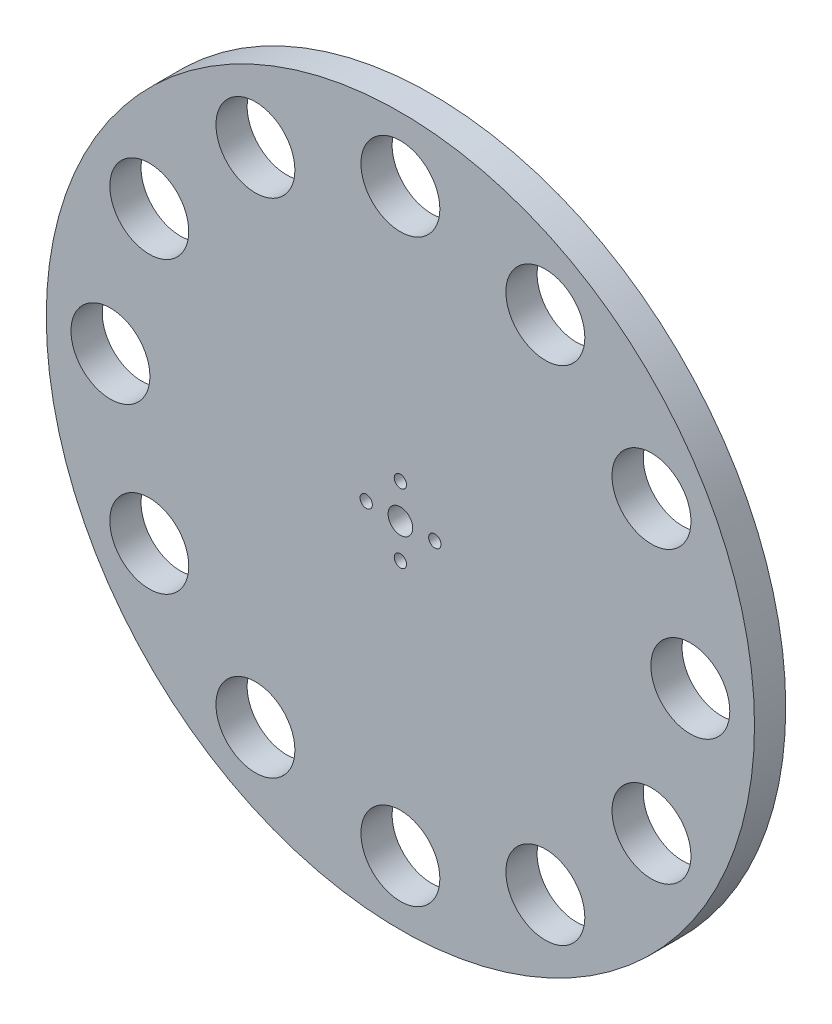
ISO-10303-21;
HEADER;
FILE_DESCRIPTION(('STEP AP214'),'2;1');
FILE_NAME('part.step','',(''),(''),'','','');
FILE_SCHEMA(('AUTOMOTIVE_DESIGN { 1 0 10303 214 1 1 1 1 }'));
ENDSEC;
DATA;
#1=APPLICATION_CONTEXT('core data for automotive mechanical design processes');
#2=APPLICATION_PROTOCOL_DEFINITION('international standard','automotive_design',2000,#1);
#3=PRODUCT_CONTEXT('',#1,'mechanical');
#4=PRODUCT('Part','Part','',(#3));
#5=PRODUCT_RELATED_PRODUCT_CATEGORY('part','',(#4));
#6=PRODUCT_DEFINITION_FORMATION('','',#4);
#7=PRODUCT_DEFINITION_CONTEXT('part definition',#1,'design');
#8=PRODUCT_DEFINITION('design','',#6,#7);
#9=PRODUCT_DEFINITION_SHAPE('','',#8);
#10=(LENGTH_UNIT() NAMED_UNIT(*) SI_UNIT(.MILLI.,.METRE.));
#11=(NAMED_UNIT(*) PLANE_ANGLE_UNIT() SI_UNIT($,.RADIAN.));
#12=(NAMED_UNIT(*) SI_UNIT($,.STERADIAN.) SOLID_ANGLE_UNIT());
#13=UNCERTAINTY_MEASURE_WITH_UNIT(LENGTH_MEASURE(1.E-05),#10,'distance_accuracy_value','');
#14=(GEOMETRIC_REPRESENTATION_CONTEXT(3) GLOBAL_UNCERTAINTY_ASSIGNED_CONTEXT((#13)) GLOBAL_UNIT_ASSIGNED_CONTEXT((#10,
#11,#12)) REPRESENTATION_CONTEXT('',''));
#15=CARTESIAN_POINT('',(0.,0.,0.));
#16=DIRECTION('',(0.,0.,1.));
#17=DIRECTION('',(1.,0.,0.));
#18=AXIS2_PLACEMENT_3D('',#15,#16,#17);
#19=CARTESIAN_POINT('',(51.0521975530926,-29.4750000000001,6.35));
#20=DIRECTION('',(0.,0.,-1.));
#21=DIRECTION('',(-1.,0.,0.));
#22=AXIS2_PLACEMENT_3D('',#19,#20,#21);
#23=CYLINDRICAL_SURFACE('',#22,8.025);
#24=CARTESIAN_POINT('',(51.0521975530926,-29.4750000000001,6.35));
#25=DIRECTION('',(0.,0.,1.));
#26=DIRECTION('',(1.,0.,0.));
#27=AXIS2_PLACEMENT_3D('',#24,#25,#26);
#28=CIRCLE('',#27,8.025);
#29=CARTESIAN_POINT('',(59.0771975530926,-29.4750000000001,6.35));
#30=VERTEX_POINT('',#29);
#31=EDGE_CURVE('E43',#30,#30,#28,.T.);
#32=ORIENTED_EDGE('',*,*,#31,.T.);
#33=EDGE_LOOP('',(#32));
#34=FACE_BOUND('',#33,.T.);
#35=CARTESIAN_POINT('',(51.0521975530926,-29.4750000000001,0.));
#36=DIRECTION('',(0.,0.,1.));
#37=DIRECTION('',(1.,0.,0.));
#38=AXIS2_PLACEMENT_3D('',#35,#36,#37);
#39=CIRCLE('',#38,8.025);
#40=CARTESIAN_POINT('',(59.0771975530926,-29.4750000000001,0.));
#41=VERTEX_POINT('',#40);
#42=EDGE_CURVE('E85',#41,#41,#39,.T.);
#43=ORIENTED_EDGE('',*,*,#42,.F.);
#44=EDGE_LOOP('',(#43));
#45=FACE_BOUND('',#44,.T.);
#46=ADVANCED_FACE('F35',(#34,#45),#23,.F.);
#47=CARTESIAN_POINT('',(29.4749999999997,-51.0521975530928,6.35));
#48=DIRECTION('',(0.,0.,-1.));
#49=DIRECTION('',(-1.,0.,0.));
#50=AXIS2_PLACEMENT_3D('',#47,#48,#49);
#51=CYLINDRICAL_SURFACE('',#50,8.02500000000001);
#52=CARTESIAN_POINT('',(29.4749999999997,-51.0521975530928,6.35));
#53=DIRECTION('',(0.,0.,1.));
#54=DIRECTION('',(1.,0.,0.));
#55=AXIS2_PLACEMENT_3D('',#52,#53,#54);
#56=CIRCLE('',#55,8.02500000000001);
#57=CARTESIAN_POINT('',(37.4999999999997,-51.0521975530928,6.35));
#58=VERTEX_POINT('',#57);
#59=EDGE_CURVE('E48',#58,#58,#56,.T.);
#60=ORIENTED_EDGE('',*,*,#59,.T.);
#61=EDGE_LOOP('',(#60));
#62=FACE_BOUND('',#61,.T.);
#63=CARTESIAN_POINT('',(29.4749999999997,-51.0521975530928,0.));
#64=DIRECTION('',(0.,0.,1.));
#65=DIRECTION('',(1.,0.,0.));
#66=AXIS2_PLACEMENT_3D('',#63,#64,#65);
#67=CIRCLE('',#66,8.02500000000001);
#68=CARTESIAN_POINT('',(37.4999999999997,-51.0521975530928,0.));
#69=VERTEX_POINT('',#68);
#70=EDGE_CURVE('E82',#69,#69,#67,.T.);
#71=ORIENTED_EDGE('',*,*,#70,.F.);
#72=EDGE_LOOP('',(#71));
#73=FACE_BOUND('',#72,.T.);
#74=ADVANCED_FACE('F129',(#62,#73),#51,.F.);
#75=CARTESIAN_POINT('',(0.,-58.95,6.35));
#76=DIRECTION('',(0.,0.,-1.));
#77=DIRECTION('',(-1.,0.,0.));
#78=AXIS2_PLACEMENT_3D('',#75,#76,#77);
#79=CYLINDRICAL_SURFACE('',#78,8.025);
#80=CARTESIAN_POINT('',(0.,-58.95,6.35));
#81=DIRECTION('',(0.,0.,1.));
#82=DIRECTION('',(1.,0.,0.));
#83=AXIS2_PLACEMENT_3D('',#80,#81,#82);
#84=CIRCLE('',#83,8.025);
#85=CARTESIAN_POINT('',(8.025,-58.95,6.35));
#86=VERTEX_POINT('',#85);
#87=EDGE_CURVE('E124',#86,#86,#84,.T.);
#88=ORIENTED_EDGE('',*,*,#87,.T.);
#89=EDGE_LOOP('',(#88));
#90=FACE_BOUND('',#89,.T.);
#91=CARTESIAN_POINT('',(0.,-58.95,0.));
#92=DIRECTION('',(0.,0.,1.));
#93=DIRECTION('',(1.,0.,0.));
#94=AXIS2_PLACEMENT_3D('',#91,#92,#93);
#95=CIRCLE('',#94,8.025);
#96=CARTESIAN_POINT('',(8.025,-58.95,0.));
#97=VERTEX_POINT('',#96);
#98=EDGE_CURVE('E79',#97,#97,#95,.T.);
#99=ORIENTED_EDGE('',*,*,#98,.F.);
#100=EDGE_LOOP('',(#99));
#101=FACE_BOUND('',#100,.T.);
#102=ADVANCED_FACE('F166',(#90,#101),#79,.F.);
#103=CARTESIAN_POINT('',(-29.4750000000002,-51.0521975530925,6.35));
#104=DIRECTION('',(0.,0.,-1.));
#105=DIRECTION('',(-1.,0.,0.));
#106=AXIS2_PLACEMENT_3D('',#103,#104,#105);
#107=CYLINDRICAL_SURFACE('',#106,8.02499999999997);
#108=CARTESIAN_POINT('',(-29.4750000000002,-51.0521975530925,6.35));
#109=DIRECTION('',(0.,0.,1.));
#110=DIRECTION('',(1.,0.,0.));
#111=AXIS2_PLACEMENT_3D('',#108,#109,#110);
#112=CIRCLE('',#111,8.02499999999997);
#113=CARTESIAN_POINT('',(-21.4500000000003,-51.0521975530925,6.35));
#114=VERTEX_POINT('',#113);
#115=EDGE_CURVE('E121',#114,#114,#112,.T.);
#116=ORIENTED_EDGE('',*,*,#115,.T.);
#117=EDGE_LOOP('',(#116));
#118=FACE_BOUND('',#117,.T.);
#119=CARTESIAN_POINT('',(-29.4750000000002,-51.0521975530925,0.));
#120=DIRECTION('',(0.,0.,1.));
#121=DIRECTION('',(1.,0.,0.));
#122=AXIS2_PLACEMENT_3D('',#119,#120,#121);
#123=CIRCLE('',#122,8.02499999999997);
#124=CARTESIAN_POINT('',(-21.4500000000003,-51.0521975530925,0.));
#125=VERTEX_POINT('',#124);
#126=EDGE_CURVE('E76',#125,#125,#123,.T.);
#127=ORIENTED_EDGE('',*,*,#126,.F.);
#128=EDGE_LOOP('',(#127));
#129=FACE_BOUND('',#128,.T.);
#130=ADVANCED_FACE('F169',(#118,#129),#107,.F.);
#131=CARTESIAN_POINT('',(-51.0521975530929,-29.4749999999997,6.35));
#132=DIRECTION('',(0.,0.,-1.));
#133=DIRECTION('',(-1.,0.,0.));
#134=AXIS2_PLACEMENT_3D('',#131,#132,#133);
#135=CYLINDRICAL_SURFACE('',#134,8.02500000000006);
#136=CARTESIAN_POINT('',(-51.0521975530929,-29.4749999999997,6.35));
#137=DIRECTION('',(0.,0.,1.));
#138=DIRECTION('',(1.,0.,0.));
#139=AXIS2_PLACEMENT_3D('',#136,#137,#138);
#140=CIRCLE('',#139,8.02500000000006);
#141=CARTESIAN_POINT('',(-43.0271975530928,-29.4749999999997,6.35));
#142=VERTEX_POINT('',#141);
#143=EDGE_CURVE('E118',#142,#142,#140,.T.);
#144=ORIENTED_EDGE('',*,*,#143,.T.);
#145=EDGE_LOOP('',(#144));
#146=FACE_BOUND('',#145,.T.);
#147=CARTESIAN_POINT('',(-51.0521975530929,-29.4749999999997,0.));
#148=DIRECTION('',(0.,0.,1.));
#149=DIRECTION('',(1.,0.,0.));
#150=AXIS2_PLACEMENT_3D('',#147,#148,#149);
#151=CIRCLE('',#150,8.02500000000006);
#152=CARTESIAN_POINT('',(-43.0271975530928,-29.4749999999997,0.));
#153=VERTEX_POINT('',#152);
#154=EDGE_CURVE('E73',#153,#153,#151,.T.);
#155=ORIENTED_EDGE('',*,*,#154,.F.);
#156=EDGE_LOOP('',(#155));
#157=FACE_BOUND('',#156,.T.);
#158=ADVANCED_FACE('F173',(#146,#157),#135,.F.);
#159=CARTESIAN_POINT('',(-58.95,0.,6.35));
#160=DIRECTION('',(0.,0.,-1.));
#161=DIRECTION('',(-1.,0.,0.));
#162=AXIS2_PLACEMENT_3D('',#159,#160,#161);
#163=CYLINDRICAL_SURFACE('',#162,8.025);
#164=CARTESIAN_POINT('',(-58.95,0.,6.35));
#165=DIRECTION('',(0.,0.,1.));
#166=DIRECTION('',(1.,0.,0.));
#167=AXIS2_PLACEMENT_3D('',#164,#165,#166);
#168=CIRCLE('',#167,8.025);
#169=CARTESIAN_POINT('',(-50.925,0.,6.35));
#170=VERTEX_POINT('',#169);
#171=EDGE_CURVE('E115',#170,#170,#168,.T.);
#172=ORIENTED_EDGE('',*,*,#171,.T.);
#173=EDGE_LOOP('',(#172));
#174=FACE_BOUND('',#173,.T.);
#175=CARTESIAN_POINT('',(-58.95,0.,0.));
#176=DIRECTION('',(0.,0.,1.));
#177=DIRECTION('',(1.,0.,0.));
#178=AXIS2_PLACEMENT_3D('',#175,#176,#177);
#179=CIRCLE('',#178,8.025);
#180=CARTESIAN_POINT('',(-50.925,0.,0.));
#181=VERTEX_POINT('',#180);
#182=EDGE_CURVE('E70',#181,#181,#179,.T.);
#183=ORIENTED_EDGE('',*,*,#182,.F.);
#184=EDGE_LOOP('',(#183));
#185=FACE_BOUND('',#184,.T.);
#186=ADVANCED_FACE('F177',(#174,#185),#163,.F.);
#187=CARTESIAN_POINT('',(-51.0521975530929,29.4749999999997,6.35));
#188=DIRECTION('',(0.,0.,-1.));
#189=DIRECTION('',(-1.,0.,0.));
#190=AXIS2_PLACEMENT_3D('',#187,#188,#189);
#191=CYLINDRICAL_SURFACE('',#190,8.02500000000005);
#192=CARTESIAN_POINT('',(-51.0521975530929,29.4749999999997,6.35));
#193=DIRECTION('',(0.,0.,1.));
#194=DIRECTION('',(1.,0.,0.));
#195=AXIS2_PLACEMENT_3D('',#192,#193,#194);
#196=CIRCLE('',#195,8.02500000000005);
#197=CARTESIAN_POINT('',(-43.0271975530928,29.4749999999997,6.35));
#198=VERTEX_POINT('',#197);
#199=EDGE_CURVE('E112',#198,#198,#196,.T.);
#200=ORIENTED_EDGE('',*,*,#199,.T.);
#201=EDGE_LOOP('',(#200));
#202=FACE_BOUND('',#201,.T.);
#203=CARTESIAN_POINT('',(-51.0521975530929,29.4749999999997,0.));
#204=DIRECTION('',(0.,0.,1.));
#205=DIRECTION('',(1.,0.,0.));
#206=AXIS2_PLACEMENT_3D('',#203,#204,#205);
#207=CIRCLE('',#206,8.02500000000005);
#208=CARTESIAN_POINT('',(-43.0271975530928,29.4749999999997,0.));
#209=VERTEX_POINT('',#208);
#210=EDGE_CURVE('E67',#209,#209,#207,.T.);
#211=ORIENTED_EDGE('',*,*,#210,.F.);
#212=EDGE_LOOP('',(#211));
#213=FACE_BOUND('',#212,.T.);
#214=ADVANCED_FACE('F181',(#202,#213),#191,.F.);
#215=CARTESIAN_POINT('',(-29.4750000000002,51.0521975530925,6.35));
#216=DIRECTION('',(0.,0.,-1.));
#217=DIRECTION('',(-1.,0.,0.));
#218=AXIS2_PLACEMENT_3D('',#215,#216,#217);
#219=CYLINDRICAL_SURFACE('',#218,8.02499999999999);
#220=CARTESIAN_POINT('',(-29.4750000000002,51.0521975530925,6.35));
#221=DIRECTION('',(0.,0.,1.));
#222=DIRECTION('',(1.,0.,0.));
#223=AXIS2_PLACEMENT_3D('',#220,#221,#222);
#224=CIRCLE('',#223,8.02499999999999);
#225=CARTESIAN_POINT('',(-21.4500000000002,51.0521975530925,6.35));
#226=VERTEX_POINT('',#225);
#227=EDGE_CURVE('E109',#226,#226,#224,.T.);
#228=ORIENTED_EDGE('',*,*,#227,.T.);
#229=EDGE_LOOP('',(#228));
#230=FACE_BOUND('',#229,.T.);
#231=CARTESIAN_POINT('',(-29.4750000000002,51.0521975530925,0.));
#232=DIRECTION('',(0.,0.,1.));
#233=DIRECTION('',(1.,0.,0.));
#234=AXIS2_PLACEMENT_3D('',#231,#232,#233);
#235=CIRCLE('',#234,8.02499999999999);
#236=CARTESIAN_POINT('',(-21.4500000000002,51.0521975530925,0.));
#237=VERTEX_POINT('',#236);
#238=EDGE_CURVE('E64',#237,#237,#235,.T.);
#239=ORIENTED_EDGE('',*,*,#238,.F.);
#240=EDGE_LOOP('',(#239));
#241=FACE_BOUND('',#240,.T.);
#242=ADVANCED_FACE('F185',(#230,#241),#219,.F.);
#243=CARTESIAN_POINT('',(0.,58.95,6.35));
#244=DIRECTION('',(0.,0.,-1.));
#245=DIRECTION('',(-1.,0.,0.));
#246=AXIS2_PLACEMENT_3D('',#243,#244,#245);
#247=CYLINDRICAL_SURFACE('',#246,8.025);
#248=CARTESIAN_POINT('',(0.,58.95,6.35));
#249=DIRECTION('',(0.,0.,1.));
#250=DIRECTION('',(1.,0.,0.));
#251=AXIS2_PLACEMENT_3D('',#248,#249,#250);
#252=CIRCLE('',#251,8.025);
#253=CARTESIAN_POINT('',(8.025,58.95,6.35));
#254=VERTEX_POINT('',#253);
#255=EDGE_CURVE('E106',#254,#254,#252,.T.);
#256=ORIENTED_EDGE('',*,*,#255,.T.);
#257=EDGE_LOOP('',(#256));
#258=FACE_BOUND('',#257,.T.);
#259=CARTESIAN_POINT('',(0.,58.95,0.));
#260=DIRECTION('',(0.,0.,1.));
#261=DIRECTION('',(1.,0.,0.));
#262=AXIS2_PLACEMENT_3D('',#259,#260,#261);
#263=CIRCLE('',#262,8.025);
#264=CARTESIAN_POINT('',(8.025,58.95,0.));
#265=VERTEX_POINT('',#264);
#266=EDGE_CURVE('E61',#265,#265,#263,.T.);
#267=ORIENTED_EDGE('',*,*,#266,.F.);
#268=EDGE_LOOP('',(#267));
#269=FACE_BOUND('',#268,.T.);
#270=ADVANCED_FACE('F189',(#258,#269),#247,.F.);
#271=CARTESIAN_POINT('',(29.4750000000002,51.0521975530925,6.35));
#272=DIRECTION('',(0.,0.,-1.));
#273=DIRECTION('',(-1.,0.,0.));
#274=AXIS2_PLACEMENT_3D('',#271,#272,#273);
#275=CYLINDRICAL_SURFACE('',#274,8.02500000000001);
#276=CARTESIAN_POINT('',(29.4750000000002,51.0521975530925,6.35));
#277=DIRECTION('',(0.,0.,1.));
#278=DIRECTION('',(1.,0.,0.));
#279=AXIS2_PLACEMENT_3D('',#276,#277,#278);
#280=CIRCLE('',#279,8.02500000000001);
#281=CARTESIAN_POINT('',(37.5000000000002,51.0521975530925,6.35));
#282=VERTEX_POINT('',#281);
#283=EDGE_CURVE('E98',#282,#282,#280,.T.);
#284=ORIENTED_EDGE('',*,*,#283,.T.);
#285=EDGE_LOOP('',(#284));
#286=FACE_BOUND('',#285,.T.);
#287=CARTESIAN_POINT('',(29.4750000000002,51.0521975530925,0.));
#288=DIRECTION('',(0.,0.,1.));
#289=DIRECTION('',(1.,0.,0.));
#290=AXIS2_PLACEMENT_3D('',#287,#288,#289);
#291=CIRCLE('',#290,8.02500000000001);
#292=CARTESIAN_POINT('',(37.5000000000002,51.0521975530925,0.));
#293=VERTEX_POINT('',#292);
#294=EDGE_CURVE('E58',#293,#293,#291,.T.);
#295=ORIENTED_EDGE('',*,*,#294,.F.);
#296=EDGE_LOOP('',(#295));
#297=FACE_BOUND('',#296,.T.);
#298=ADVANCED_FACE('F193',(#286,#297),#275,.F.);
#299=CARTESIAN_POINT('',(51.0521975530926,29.4750000000001,6.35));
#300=DIRECTION('',(0.,0.,-1.));
#301=DIRECTION('',(-1.,0.,0.));
#302=AXIS2_PLACEMENT_3D('',#299,#300,#301);
#303=CYLINDRICAL_SURFACE('',#302,8.025);
#304=CARTESIAN_POINT('',(51.0521975530926,29.4750000000001,6.35));
#305=DIRECTION('',(0.,0.,1.));
#306=DIRECTION('',(1.,0.,0.));
#307=AXIS2_PLACEMENT_3D('',#304,#305,#306);
#308=CIRCLE('',#307,8.025);
#309=CARTESIAN_POINT('',(59.0771975530926,29.4750000000001,6.35));
#310=VERTEX_POINT('',#309);
#311=EDGE_CURVE('E93',#310,#310,#308,.T.);
#312=ORIENTED_EDGE('',*,*,#311,.T.);
#313=EDGE_LOOP('',(#312));
#314=FACE_BOUND('',#313,.T.);
#315=CARTESIAN_POINT('',(51.0521975530926,29.4750000000001,0.));
#316=DIRECTION('',(0.,0.,1.));
#317=DIRECTION('',(1.,0.,0.));
#318=AXIS2_PLACEMENT_3D('',#315,#316,#317);
#319=CIRCLE('',#318,8.025);
#320=CARTESIAN_POINT('',(59.0771975530926,29.4750000000001,0.));
#321=VERTEX_POINT('',#320);
#322=EDGE_CURVE('E55',#321,#321,#319,.T.);
#323=ORIENTED_EDGE('',*,*,#322,.F.);
#324=EDGE_LOOP('',(#323));
#325=FACE_BOUND('',#324,.T.);
#326=ADVANCED_FACE('F196',(#314,#325),#303,.F.);
#327=CARTESIAN_POINT('',(58.95,0.,6.35));
#328=DIRECTION('',(0.,0.,-1.));
#329=DIRECTION('',(-1.,0.,0.));
#330=AXIS2_PLACEMENT_3D('',#327,#328,#329);
#331=CYLINDRICAL_SURFACE('',#330,8.025);
#332=CARTESIAN_POINT('',(58.95,0.,6.35));
#333=DIRECTION('',(0.,0.,1.));
#334=DIRECTION('',(1.,0.,0.));
#335=AXIS2_PLACEMENT_3D('',#332,#333,#334);
#336=CIRCLE('',#335,8.025);
#337=CARTESIAN_POINT('',(66.975,0.,6.35));
#338=VERTEX_POINT('',#337);
#339=EDGE_CURVE('E89',#338,#338,#336,.T.);
#340=ORIENTED_EDGE('',*,*,#339,.T.);
#341=EDGE_LOOP('',(#340));
#342=FACE_BOUND('',#341,.T.);
#343=CARTESIAN_POINT('',(58.95,0.,0.));
#344=DIRECTION('',(0.,0.,1.));
#345=DIRECTION('',(1.,0.,0.));
#346=AXIS2_PLACEMENT_3D('',#343,#344,#345);
#347=CIRCLE('',#346,8.025);
#348=CARTESIAN_POINT('',(66.975,0.,0.));
#349=VERTEX_POINT('',#348);
#350=EDGE_CURVE('E52',#349,#349,#347,.T.);
#351=ORIENTED_EDGE('',*,*,#350,.F.);
#352=EDGE_LOOP('',(#351));
#353=FACE_BOUND('',#352,.T.);
#354=ADVANCED_FACE('F37',(#342,#353),#331,.F.);
#355=CARTESIAN_POINT('',(0.,0.,6.35));
#356=DIRECTION('',(0.,0.,-1.));
#357=DIRECTION('',(-1.,0.,0.));
#358=AXIS2_PLACEMENT_3D('',#355,#356,#357);
#359=CYLINDRICAL_SURFACE('',#358,72.);
#360=CARTESIAN_POINT('',(0.,0.,6.35));
#361=DIRECTION('',(0.,0.,1.));
#362=DIRECTION('',(1.,0.,0.));
#363=AXIS2_PLACEMENT_3D('',#360,#361,#362);
#364=CIRCLE('',#363,72.);
#365=CARTESIAN_POINT('',(72.,0.,6.35));
#366=VERTEX_POINT('',#365);
#367=EDGE_CURVE('E10',#366,#366,#364,.T.);
#368=ORIENTED_EDGE('',*,*,#367,.F.);
#369=EDGE_LOOP('',(#368));
#370=FACE_BOUND('',#369,.T.);
#371=CARTESIAN_POINT('',(0.,0.,0.));
#372=DIRECTION('',(0.,0.,1.));
#373=DIRECTION('',(1.,0.,0.));
#374=AXIS2_PLACEMENT_3D('',#371,#372,#373);
#375=CIRCLE('',#374,72.);
#376=CARTESIAN_POINT('',(72.,0.,0.));
#377=VERTEX_POINT('',#376);
#378=EDGE_CURVE('E87',#377,#377,#375,.T.);
#379=ORIENTED_EDGE('',*,*,#378,.T.);
#380=EDGE_LOOP('',(#379));
#381=FACE_BOUND('',#380,.T.);
#382=ADVANCED_FACE('F136',(#370,#381),#359,.T.);
#383=CARTESIAN_POINT('',(0.,0.,6.35));
#384=DIRECTION('',(0.,0.,1.));
#385=DIRECTION('',(1.,0.,0.));
#386=AXIS2_PLACEMENT_3D('',#383,#384,#385);
#387=PLANE('',#386);
#388=CARTESIAN_POINT('',(7.,0.,6.35));
#389=DIRECTION('',(0.,0.,1.));
#390=DIRECTION('',(1.,0.,0.));
#391=AXIS2_PLACEMENT_3D('',#388,#389,#390);
#392=CIRCLE('',#391,1.24999999999999);
#393=CARTESIAN_POINT('',(8.24999999999999,0.,6.35));
#394=VERTEX_POINT('',#393);
#395=EDGE_CURVE('E328',#394,#394,#392,.T.);
#396=ORIENTED_EDGE('',*,*,#395,.F.);
#397=EDGE_LOOP('',(#396));
#398=FACE_BOUND('',#397,.T.);
#399=CARTESIAN_POINT('',(0.,-7.,6.35));
#400=DIRECTION('',(0.,0.,1.));
#401=DIRECTION('',(1.,0.,0.));
#402=AXIS2_PLACEMENT_3D('',#399,#400,#401);
#403=CIRCLE('',#402,1.24999999999999);
#404=CARTESIAN_POINT('',(1.24999999999999,-7.,6.35));
#405=VERTEX_POINT('',#404);
#406=EDGE_CURVE('E330',#405,#405,#403,.T.);
#407=ORIENTED_EDGE('',*,*,#406,.F.);
#408=EDGE_LOOP('',(#407));
#409=FACE_BOUND('',#408,.T.);
#410=CARTESIAN_POINT('',(0.,7.,6.35));
#411=DIRECTION('',(0.,0.,1.));
#412=DIRECTION('',(1.,0.,0.));
#413=AXIS2_PLACEMENT_3D('',#410,#411,#412);
#414=CIRCLE('',#413,1.24999999999999);
#415=CARTESIAN_POINT('',(1.24999999999999,7.,6.35));
#416=VERTEX_POINT('',#415);
#417=EDGE_CURVE('E338',#416,#416,#414,.T.);
#418=ORIENTED_EDGE('',*,*,#417,.F.);
#419=EDGE_LOOP('',(#418));
#420=FACE_BOUND('',#419,.T.);
#421=CARTESIAN_POINT('',(-6.94699297977161,0.,6.35));
#422=DIRECTION('',(0.,0.,1.));
#423=DIRECTION('',(1.,0.,0.));
#424=AXIS2_PLACEMENT_3D('',#421,#422,#423);
#425=CIRCLE('',#424,1.24999999999999);
#426=CARTESIAN_POINT('',(-5.69699297977162,0.,6.35));
#427=VERTEX_POINT('',#426);
#428=EDGE_CURVE('E344',#427,#427,#425,.T.);
#429=ORIENTED_EDGE('',*,*,#428,.F.);
#430=EDGE_LOOP('',(#429));
#431=FACE_BOUND('',#430,.T.);
#432=CARTESIAN_POINT('',(0.,0.,6.35));
#433=DIRECTION('',(0.,0.,1.));
#434=DIRECTION('',(1.,0.,0.));
#435=AXIS2_PLACEMENT_3D('',#432,#433,#434);
#436=CIRCLE('',#435,2.5);
#437=CARTESIAN_POINT('',(2.5,0.,6.35));
#438=VERTEX_POINT('',#437);
#439=EDGE_CURVE('E101',#438,#438,#436,.T.);
#440=ORIENTED_EDGE('',*,*,#439,.F.);
#441=EDGE_LOOP('',(#440));
#442=FACE_BOUND('',#441,.T.);
#443=ORIENTED_EDGE('',*,*,#339,.F.);
#444=EDGE_LOOP('',(#443));
#445=FACE_BOUND('',#444,.T.);
#446=ORIENTED_EDGE('',*,*,#311,.F.);
#447=EDGE_LOOP('',(#446));
#448=FACE_BOUND('',#447,.T.);
#449=ORIENTED_EDGE('',*,*,#283,.F.);
#450=EDGE_LOOP('',(#449));
#451=FACE_BOUND('',#450,.T.);
#452=ORIENTED_EDGE('',*,*,#255,.F.);
#453=EDGE_LOOP('',(#452));
#454=FACE_BOUND('',#453,.T.);
#455=ORIENTED_EDGE('',*,*,#227,.F.);
#456=EDGE_LOOP('',(#455));
#457=FACE_BOUND('',#456,.T.);
#458=ORIENTED_EDGE('',*,*,#199,.F.);
#459=EDGE_LOOP('',(#458));
#460=FACE_BOUND('',#459,.T.);
#461=ORIENTED_EDGE('',*,*,#171,.F.);
#462=EDGE_LOOP('',(#461));
#463=FACE_BOUND('',#462,.T.);
#464=ORIENTED_EDGE('',*,*,#143,.F.);
#465=EDGE_LOOP('',(#464));
#466=FACE_BOUND('',#465,.T.);
#467=ORIENTED_EDGE('',*,*,#115,.F.);
#468=EDGE_LOOP('',(#467));
#469=FACE_BOUND('',#468,.T.);
#470=ORIENTED_EDGE('',*,*,#87,.F.);
#471=EDGE_LOOP('',(#470));
#472=FACE_BOUND('',#471,.T.);
#473=ORIENTED_EDGE('',*,*,#59,.F.);
#474=EDGE_LOOP('',(#473));
#475=FACE_BOUND('',#474,.T.);
#476=ORIENTED_EDGE('',*,*,#31,.F.);
#477=EDGE_LOOP('',(#476));
#478=FACE_BOUND('',#477,.T.);
#479=ORIENTED_EDGE('',*,*,#367,.T.);
#480=EDGE_LOOP('',(#479));
#481=FACE_BOUND('',#480,.T.);
#482=ADVANCED_FACE('F132',(#398,#409,#420,#431,#442,#445,#448,#451,#454,#457,#460,#463,#466,
#469,#472,#475,#478,#481),#387,.T.);
#483=CARTESIAN_POINT('',(0.,0.,0.));
#484=DIRECTION('',(0.,0.,1.));
#485=DIRECTION('',(1.,0.,0.));
#486=AXIS2_PLACEMENT_3D('',#483,#484,#485);
#487=PLANE('',#486);
#488=CARTESIAN_POINT('',(7.,0.,0.));
#489=DIRECTION('',(0.,0.,1.));
#490=DIRECTION('',(1.,0.,0.));
#491=AXIS2_PLACEMENT_3D('',#488,#489,#490);
#492=CIRCLE('',#491,1.25);
#493=CARTESIAN_POINT('',(8.25,0.,0.));
#494=VERTEX_POINT('',#493);
#495=EDGE_CURVE('E325',#494,#494,#492,.T.);
#496=ORIENTED_EDGE('',*,*,#495,.T.);
#497=EDGE_LOOP('',(#496));
#498=FACE_BOUND('',#497,.T.);
#499=CARTESIAN_POINT('',(0.,-7.,0.));
#500=DIRECTION('',(0.,0.,1.));
#501=DIRECTION('',(1.,0.,0.));
#502=AXIS2_PLACEMENT_3D('',#499,#500,#501);
#503=CIRCLE('',#502,1.25);
#504=CARTESIAN_POINT('',(1.25,-7.,0.));
#505=VERTEX_POINT('',#504);
#506=EDGE_CURVE('E335',#505,#505,#503,.T.);
#507=ORIENTED_EDGE('',*,*,#506,.T.);
#508=EDGE_LOOP('',(#507));
#509=FACE_BOUND('',#508,.T.);
#510=CARTESIAN_POINT('',(0.,7.,0.));
#511=DIRECTION('',(0.,0.,1.));
#512=DIRECTION('',(1.,0.,0.));
#513=AXIS2_PLACEMENT_3D('',#510,#511,#512);
#514=CIRCLE('',#513,1.25);
#515=CARTESIAN_POINT('',(1.25,7.,0.));
#516=VERTEX_POINT('',#515);
#517=EDGE_CURVE('E341',#516,#516,#514,.T.);
#518=ORIENTED_EDGE('',*,*,#517,.T.);
#519=EDGE_LOOP('',(#518));
#520=FACE_BOUND('',#519,.T.);
#521=CARTESIAN_POINT('',(-6.94699297977161,0.,0.));
#522=DIRECTION('',(0.,0.,1.));
#523=DIRECTION('',(1.,0.,0.));
#524=AXIS2_PLACEMENT_3D('',#521,#522,#523);
#525=CIRCLE('',#524,1.25);
#526=CARTESIAN_POINT('',(-5.69699297977161,0.,0.));
#527=VERTEX_POINT('',#526);
#528=EDGE_CURVE('E346',#527,#527,#525,.T.);
#529=ORIENTED_EDGE('',*,*,#528,.T.);
#530=EDGE_LOOP('',(#529));
#531=FACE_BOUND('',#530,.T.);
#532=CARTESIAN_POINT('',(0.,0.,0.));
#533=DIRECTION('',(0.,0.,1.));
#534=DIRECTION('',(1.,0.,0.));
#535=AXIS2_PLACEMENT_3D('',#532,#533,#534);
#536=CIRCLE('',#535,2.5);
#537=CARTESIAN_POINT('',(2.5,0.,0.));
#538=VERTEX_POINT('',#537);
#539=EDGE_CURVE('E39',#538,#538,#536,.T.);
#540=ORIENTED_EDGE('',*,*,#539,.T.);
#541=EDGE_LOOP('',(#540));
#542=FACE_BOUND('',#541,.T.);
#543=ORIENTED_EDGE('',*,*,#350,.T.);
#544=EDGE_LOOP('',(#543));
#545=FACE_BOUND('',#544,.T.);
#546=ORIENTED_EDGE('',*,*,#322,.T.);
#547=EDGE_LOOP('',(#546));
#548=FACE_BOUND('',#547,.T.);
#549=ORIENTED_EDGE('',*,*,#294,.T.);
#550=EDGE_LOOP('',(#549));
#551=FACE_BOUND('',#550,.T.);
#552=ORIENTED_EDGE('',*,*,#266,.T.);
#553=EDGE_LOOP('',(#552));
#554=FACE_BOUND('',#553,.T.);
#555=ORIENTED_EDGE('',*,*,#238,.T.);
#556=EDGE_LOOP('',(#555));
#557=FACE_BOUND('',#556,.T.);
#558=ORIENTED_EDGE('',*,*,#210,.T.);
#559=EDGE_LOOP('',(#558));
#560=FACE_BOUND('',#559,.T.);
#561=ORIENTED_EDGE('',*,*,#182,.T.);
#562=EDGE_LOOP('',(#561));
#563=FACE_BOUND('',#562,.T.);
#564=ORIENTED_EDGE('',*,*,#154,.T.);
#565=EDGE_LOOP('',(#564));
#566=FACE_BOUND('',#565,.T.);
#567=ORIENTED_EDGE('',*,*,#126,.T.);
#568=EDGE_LOOP('',(#567));
#569=FACE_BOUND('',#568,.T.);
#570=ORIENTED_EDGE('',*,*,#98,.T.);
#571=EDGE_LOOP('',(#570));
#572=FACE_BOUND('',#571,.T.);
#573=ORIENTED_EDGE('',*,*,#70,.T.);
#574=EDGE_LOOP('',(#573));
#575=FACE_BOUND('',#574,.T.);
#576=ORIENTED_EDGE('',*,*,#42,.T.);
#577=EDGE_LOOP('',(#576));
#578=FACE_BOUND('',#577,.T.);
#579=ORIENTED_EDGE('',*,*,#378,.F.);
#580=EDGE_LOOP('',(#579));
#581=FACE_BOUND('',#580,.T.);
#582=ADVANCED_FACE('F135',(#498,#509,#520,#531,#542,#545,#548,#551,#554,#557,#560,#563,#566,
#569,#572,#575,#578,#581),#487,.F.);
#583=CARTESIAN_POINT('',(0.,0.,-3.65));
#584=DIRECTION('',(0.,0.,1.));
#585=DIRECTION('',(1.,0.,0.));
#586=AXIS2_PLACEMENT_3D('',#583,#584,#585);
#587=CYLINDRICAL_SURFACE('',#586,2.5);
#588=ORIENTED_EDGE('',*,*,#439,.T.);
#589=EDGE_LOOP('',(#588));
#590=FACE_BOUND('',#589,.T.);
#591=ORIENTED_EDGE('',*,*,#539,.F.);
#592=EDGE_LOOP('',(#591));
#593=FACE_BOUND('',#592,.T.);
#594=ADVANCED_FACE('F148',(#590,#593),#587,.F.);
#595=CARTESIAN_POINT('',(-6.94699297977161,0.,6.35));
#596=DIRECTION('',(0.,0.,1.));
#597=DIRECTION('',(1.,0.,0.));
#598=AXIS2_PLACEMENT_3D('',#595,#596,#597);
#599=CYLINDRICAL_SURFACE('',#598,1.24999999999999);
#600=ORIENTED_EDGE('',*,*,#528,.F.);
#601=EDGE_LOOP('',(#600));
#602=FACE_BOUND('',#601,.T.);
#603=ORIENTED_EDGE('',*,*,#428,.T.);
#604=EDGE_LOOP('',(#603));
#605=FACE_BOUND('',#604,.T.);
#606=ADVANCED_FACE('F155',(#602,#605),#599,.F.);
#607=CARTESIAN_POINT('',(0.,7.,6.35));
#608=DIRECTION('',(0.,0.,1.));
#609=DIRECTION('',(1.,0.,0.));
#610=AXIS2_PLACEMENT_3D('',#607,#608,#609);
#611=CYLINDRICAL_SURFACE('',#610,1.24999999999999);
#612=ORIENTED_EDGE('',*,*,#517,.F.);
#613=EDGE_LOOP('',(#612));
#614=FACE_BOUND('',#613,.T.);
#615=ORIENTED_EDGE('',*,*,#417,.T.);
#616=EDGE_LOOP('',(#615));
#617=FACE_BOUND('',#616,.T.);
#618=ADVANCED_FACE('F281',(#614,#617),#611,.F.);
#619=CARTESIAN_POINT('',(0.,-7.,6.35));
#620=DIRECTION('',(0.,0.,1.));
#621=DIRECTION('',(1.,0.,0.));
#622=AXIS2_PLACEMENT_3D('',#619,#620,#621);
#623=CYLINDRICAL_SURFACE('',#622,1.24999999999999);
#624=ORIENTED_EDGE('',*,*,#506,.F.);
#625=EDGE_LOOP('',(#624));
#626=FACE_BOUND('',#625,.T.);
#627=ORIENTED_EDGE('',*,*,#406,.T.);
#628=EDGE_LOOP('',(#627));
#629=FACE_BOUND('',#628,.T.);
#630=ADVANCED_FACE('F288',(#626,#629),#623,.F.);
#631=CARTESIAN_POINT('',(7.,0.,6.35));
#632=DIRECTION('',(0.,0.,1.));
#633=DIRECTION('',(1.,0.,0.));
#634=AXIS2_PLACEMENT_3D('',#631,#632,#633);
#635=CYLINDRICAL_SURFACE('',#634,1.24999999999999);
#636=ORIENTED_EDGE('',*,*,#495,.F.);
#637=EDGE_LOOP('',(#636));
#638=FACE_BOUND('',#637,.T.);
#639=ORIENTED_EDGE('',*,*,#395,.T.);
#640=EDGE_LOOP('',(#639));
#641=FACE_BOUND('',#640,.T.);
#642=ADVANCED_FACE('F296',(#638,#641),#635,.F.);
#643=CLOSED_SHELL('',(#46,#74,#102,#130,#158,#186,#214,#242,#270,#298,#326,#354,#382,#482,#582,
#594,#606,#618,#630,#642));
#644=MANIFOLD_SOLID_BREP('B2',#643);
#645=ADVANCED_BREP_SHAPE_REPRESENTATION('',(#18,#644),#14);
#646=SHAPE_DEFINITION_REPRESENTATION(#9,#645);
ENDSEC;
END-ISO-10303-21;
